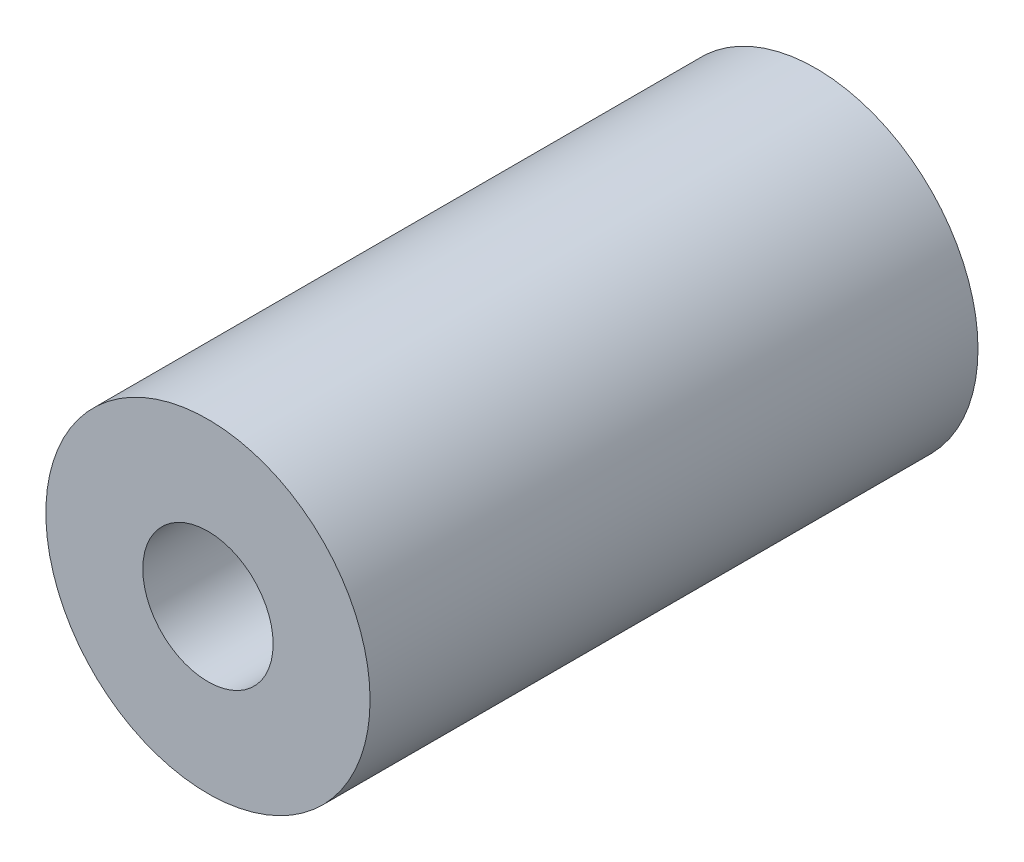
ISO-10303-21;
HEADER;
FILE_DESCRIPTION(('STEP AP214'),'2;1');
FILE_NAME('part.step','',(''),(''),'','','');
FILE_SCHEMA(('AUTOMOTIVE_DESIGN { 1 0 10303 214 1 1 1 1 }'));
ENDSEC;
DATA;
#1=APPLICATION_CONTEXT('core data for automotive mechanical design processes');
#2=APPLICATION_PROTOCOL_DEFINITION('international standard','automotive_design',2000,#1);
#3=PRODUCT_CONTEXT('',#1,'mechanical');
#4=PRODUCT('Part','Part','',(#3));
#5=PRODUCT_RELATED_PRODUCT_CATEGORY('part','',(#4));
#6=PRODUCT_DEFINITION_FORMATION('','',#4);
#7=PRODUCT_DEFINITION_CONTEXT('part definition',#1,'design');
#8=PRODUCT_DEFINITION('design','',#6,#7);
#9=PRODUCT_DEFINITION_SHAPE('','',#8);
#10=(LENGTH_UNIT() NAMED_UNIT(*) SI_UNIT(.MILLI.,.METRE.));
#11=(NAMED_UNIT(*) PLANE_ANGLE_UNIT() SI_UNIT($,.RADIAN.));
#12=(NAMED_UNIT(*) SI_UNIT($,.STERADIAN.) SOLID_ANGLE_UNIT());
#13=UNCERTAINTY_MEASURE_WITH_UNIT(LENGTH_MEASURE(1.E-05),#10,'distance_accuracy_value','');
#14=(GEOMETRIC_REPRESENTATION_CONTEXT(3) GLOBAL_UNCERTAINTY_ASSIGNED_CONTEXT((#13)) GLOBAL_UNIT_ASSIGNED_CONTEXT((#10,
#11,#12)) REPRESENTATION_CONTEXT('',''));
#15=CARTESIAN_POINT('',(0.,0.,0.));
#16=DIRECTION('',(0.,0.,1.));
#17=DIRECTION('',(1.,0.,0.));
#18=AXIS2_PLACEMENT_3D('',#15,#16,#17);
#19=CARTESIAN_POINT('',(0.,0.,11.90625));
#20=DIRECTION('',(0.,0.,-1.));
#21=DIRECTION('',(-1.,0.,0.));
#22=AXIS2_PLACEMENT_3D('',#19,#20,#21);
#23=CYLINDRICAL_SURFACE('',#22,6.35);
#24=CARTESIAN_POINT('',(0.,0.,11.90625));
#25=DIRECTION('',(0.,0.,1.));
#26=DIRECTION('',(1.,0.,0.));
#27=AXIS2_PLACEMENT_3D('',#24,#25,#26);
#28=CIRCLE('',#27,6.35);
#29=CARTESIAN_POINT('',(6.35,0.,11.90625));
#30=VERTEX_POINT('',#29);
#31=EDGE_CURVE('E10',#30,#30,#28,.T.);
#32=ORIENTED_EDGE('',*,*,#31,.F.);
#33=EDGE_LOOP('',(#32));
#34=FACE_BOUND('',#33,.T.);
#35=CARTESIAN_POINT('',(0.,0.,-11.90625));
#36=DIRECTION('',(0.,0.,1.));
#37=DIRECTION('',(1.,0.,0.));
#38=AXIS2_PLACEMENT_3D('',#35,#36,#37);
#39=CIRCLE('',#38,6.35);
#40=CARTESIAN_POINT('',(6.35,0.,-11.90625));
#41=VERTEX_POINT('',#40);
#42=EDGE_CURVE('E42',#41,#41,#39,.T.);
#43=ORIENTED_EDGE('',*,*,#42,.T.);
#44=EDGE_LOOP('',(#43));
#45=FACE_BOUND('',#44,.T.);
#46=ADVANCED_FACE('F39',(#34,#45),#23,.T.);
#47=CARTESIAN_POINT('',(0.,0.,11.90625));
#48=DIRECTION('',(0.,0.,1.));
#49=DIRECTION('',(1.,0.,0.));
#50=AXIS2_PLACEMENT_3D('',#47,#48,#49);
#51=PLANE('',#50);
#52=CARTESIAN_POINT('',(0.,0.,11.90625));
#53=DIRECTION('',(0.,0.,1.));
#54=DIRECTION('',(1.,0.,0.));
#55=AXIS2_PLACEMENT_3D('',#52,#53,#54);
#56=CIRCLE('',#55,2.5527);
#57=CARTESIAN_POINT('',(2.5527,0.,11.90625));
#58=VERTEX_POINT('',#57);
#59=EDGE_CURVE('E53',#58,#58,#56,.T.);
#60=ORIENTED_EDGE('',*,*,#59,.F.);
#61=EDGE_LOOP('',(#60));
#62=FACE_BOUND('',#61,.T.);
#63=ORIENTED_EDGE('',*,*,#31,.T.);
#64=EDGE_LOOP('',(#63));
#65=FACE_BOUND('',#64,.T.);
#66=ADVANCED_FACE('F59',(#62,#65),#51,.T.);
#67=CARTESIAN_POINT('',(0.,0.,-11.90625));
#68=DIRECTION('',(0.,0.,1.));
#69=DIRECTION('',(1.,0.,0.));
#70=AXIS2_PLACEMENT_3D('',#67,#68,#69);
#71=PLANE('',#70);
#72=CARTESIAN_POINT('',(0.,0.,-11.90625));
#73=DIRECTION('',(0.,0.,-1.));
#74=DIRECTION('',(-1.,0.,0.));
#75=AXIS2_PLACEMENT_3D('',#72,#73,#74);
#76=CIRCLE('',#75,2.5527);
#77=CARTESIAN_POINT('',(-2.5527,0.,-11.90625));
#78=VERTEX_POINT('',#77);
#79=EDGE_CURVE('E49',#78,#78,#76,.T.);
#80=ORIENTED_EDGE('',*,*,#79,.F.);
#81=EDGE_LOOP('',(#80));
#82=FACE_BOUND('',#81,.T.);
#83=ORIENTED_EDGE('',*,*,#42,.F.);
#84=EDGE_LOOP('',(#83));
#85=FACE_BOUND('',#84,.T.);
#86=ADVANCED_FACE('F61',(#82,#85),#71,.F.);
#87=CARTESIAN_POINT('',(0.,0.,-11.90625));
#88=DIRECTION('',(0.,0.,-1.));
#89=DIRECTION('',(-1.,0.,0.));
#90=AXIS2_PLACEMENT_3D('',#87,#88,#89);
#91=CYLINDRICAL_SURFACE('',#90,2.5527);
#92=ORIENTED_EDGE('',*,*,#79,.T.);
#93=EDGE_LOOP('',(#92));
#94=FACE_BOUND('',#93,.T.);
#95=ORIENTED_EDGE('',*,*,#59,.T.);
#96=EDGE_LOOP('',(#95));
#97=FACE_BOUND('',#96,.T.);
#98=ADVANCED_FACE('F57',(#94,#97),#91,.F.);
#99=CLOSED_SHELL('',(#46,#66,#86,#98));
#100=MANIFOLD_SOLID_BREP('B2',#99);
#101=ADVANCED_BREP_SHAPE_REPRESENTATION('',(#18,#100),#14);
#102=SHAPE_DEFINITION_REPRESENTATION(#9,#101);
ENDSEC;
END-ISO-10303-21;
